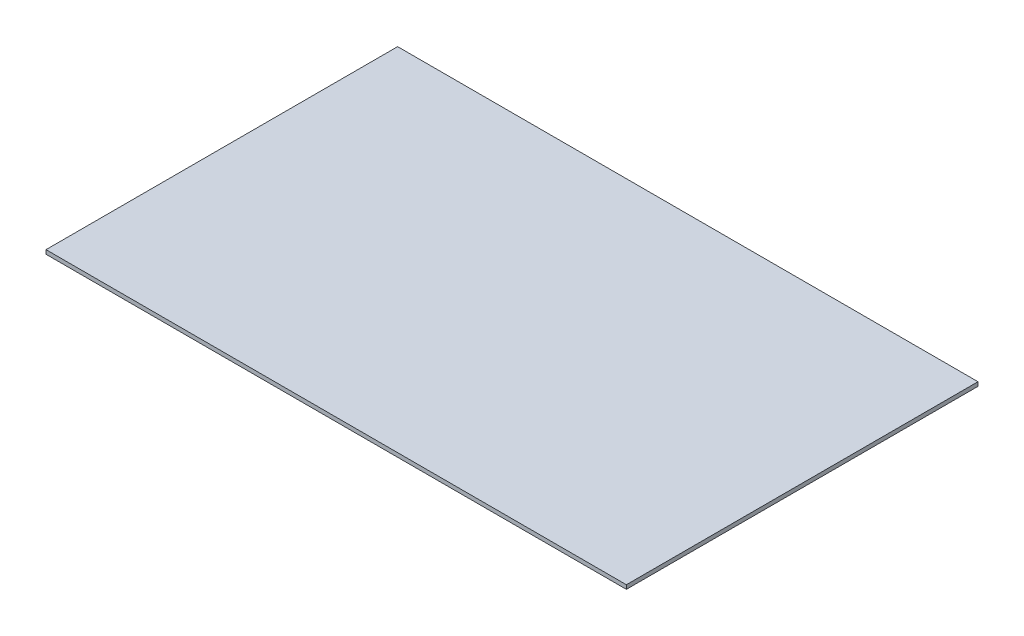
ISO-10303-21;
HEADER;
FILE_DESCRIPTION(('STEP AP214'),'2;1');
FILE_NAME('part.step','',(''),(''),'','','');
FILE_SCHEMA(('AUTOMOTIVE_DESIGN { 1 0 10303 214 1 1 1 1 }'));
ENDSEC;
DATA;
#1=APPLICATION_CONTEXT('core data for automotive mechanical design processes');
#2=APPLICATION_PROTOCOL_DEFINITION('international standard','automotive_design',2000,#1);
#3=PRODUCT_CONTEXT('',#1,'mechanical');
#4=PRODUCT('Part','Part','',(#3));
#5=PRODUCT_RELATED_PRODUCT_CATEGORY('part','',(#4));
#6=PRODUCT_DEFINITION_FORMATION('','',#4);
#7=PRODUCT_DEFINITION_CONTEXT('part definition',#1,'design');
#8=PRODUCT_DEFINITION('design','',#6,#7);
#9=PRODUCT_DEFINITION_SHAPE('','',#8);
#10=(LENGTH_UNIT() NAMED_UNIT(*) SI_UNIT(.MILLI.,.METRE.));
#11=(NAMED_UNIT(*) PLANE_ANGLE_UNIT() SI_UNIT($,.RADIAN.));
#12=(NAMED_UNIT(*) SI_UNIT($,.STERADIAN.) SOLID_ANGLE_UNIT());
#13=UNCERTAINTY_MEASURE_WITH_UNIT(LENGTH_MEASURE(1.E-05),#10,'distance_accuracy_value','');
#14=(GEOMETRIC_REPRESENTATION_CONTEXT(3) GLOBAL_UNCERTAINTY_ASSIGNED_CONTEXT((#13)) GLOBAL_UNIT_ASSIGNED_CONTEXT((#10,
#11,#12)) REPRESENTATION_CONTEXT('',''));
#15=CARTESIAN_POINT('',(0.,0.,0.));
#16=DIRECTION('',(0.,0.,1.));
#17=DIRECTION('',(1.,0.,0.));
#18=AXIS2_PLACEMENT_3D('',#15,#16,#17);
#19=CARTESIAN_POINT('',(0.,0.,277.48));
#20=DIRECTION('',(-1.,0.,0.));
#21=DIRECTION('',(0.,0.,1.));
#22=AXIS2_PLACEMENT_3D('',#19,#20,#21);
#23=PLANE('',#22);
#24=DIRECTION('',(0.,1.,0.));
#25=VECTOR('',#24,1.);
#26=CARTESIAN_POINT('',(0.,0.,0.));
#27=LINE('',#26,#25);
#28=CARTESIAN_POINT('',(0.,0.,0.));
#29=VERTEX_POINT('',#28);
#30=CARTESIAN_POINT('',(0.,3.175,0.));
#31=VERTEX_POINT('',#30);
#32=EDGE_CURVE('E116',#29,#31,#27,.T.);
#33=ORIENTED_EDGE('',*,*,#32,.F.);
#34=DIRECTION('',(0.,0.,-1.));
#35=VECTOR('',#34,1.);
#36=CARTESIAN_POINT('',(0.,0.,277.48));
#37=LINE('',#36,#35);
#38=CARTESIAN_POINT('',(0.,0.,277.48));
#39=VERTEX_POINT('',#38);
#40=EDGE_CURVE('E11',#39,#29,#37,.T.);
#41=ORIENTED_EDGE('',*,*,#40,.F.);
#42=DIRECTION('',(0.,1.,0.));
#43=VECTOR('',#42,1.);
#44=CARTESIAN_POINT('',(0.,0.,277.48));
#45=LINE('',#44,#43);
#46=CARTESIAN_POINT('',(0.,3.175,277.48));
#47=VERTEX_POINT('',#46);
#48=EDGE_CURVE('E108',#39,#47,#45,.T.);
#49=ORIENTED_EDGE('',*,*,#48,.T.);
#50=DIRECTION('',(0.,0.,-1.));
#51=VECTOR('',#50,1.);
#52=CARTESIAN_POINT('',(0.,3.175,277.48));
#53=LINE('',#52,#51);
#54=EDGE_CURVE('E48',#47,#31,#53,.T.);
#55=ORIENTED_EDGE('',*,*,#54,.T.);
#56=EDGE_LOOP('',(#33,#41,#49,#55));
#57=FACE_BOUND('',#56,.T.);
#58=ADVANCED_FACE('F45',(#57),#23,.T.);
#59=CARTESIAN_POINT('',(0.,0.,277.48));
#60=DIRECTION('',(0.,1.,0.));
#61=DIRECTION('',(0.,0.,1.));
#62=AXIS2_PLACEMENT_3D('',#59,#60,#61);
#63=PLANE('',#62);
#64=DIRECTION('',(1.,0.,0.));
#65=VECTOR('',#64,1.);
#66=CARTESIAN_POINT('',(0.,0.,0.));
#67=LINE('',#66,#65);
#68=CARTESIAN_POINT('',(458.,0.,0.));
#69=VERTEX_POINT('',#68);
#70=EDGE_CURVE('E111',#29,#69,#67,.T.);
#71=ORIENTED_EDGE('',*,*,#70,.T.);
#72=DIRECTION('',(0.,0.,-1.));
#73=VECTOR('',#72,1.);
#74=CARTESIAN_POINT('',(458.,0.,277.48));
#75=LINE('',#74,#73);
#76=CARTESIAN_POINT('',(458.,0.,277.48));
#77=VERTEX_POINT('',#76);
#78=EDGE_CURVE('E55',#77,#69,#75,.T.);
#79=ORIENTED_EDGE('',*,*,#78,.F.);
#80=DIRECTION('',(1.,0.,0.));
#81=VECTOR('',#80,1.);
#82=CARTESIAN_POINT('',(0.,0.,277.48));
#83=LINE('',#82,#81);
#84=EDGE_CURVE('E103',#39,#77,#83,.T.);
#85=ORIENTED_EDGE('',*,*,#84,.F.);
#86=ORIENTED_EDGE('',*,*,#40,.T.);
#87=EDGE_LOOP('',(#71,#79,#85,#86));
#88=FACE_BOUND('',#87,.T.);
#89=ADVANCED_FACE('F131',(#88),#63,.F.);
#90=CARTESIAN_POINT('',(458.,3.175,277.48));
#91=DIRECTION('',(1.,0.,0.));
#92=DIRECTION('',(0.,0.,-1.));
#93=AXIS2_PLACEMENT_3D('',#90,#91,#92);
#94=PLANE('',#93);
#95=DIRECTION('',(0.,-1.,0.));
#96=VECTOR('',#95,1.);
#97=CARTESIAN_POINT('',(458.,3.175,0.));
#98=LINE('',#97,#96);
#99=CARTESIAN_POINT('',(458.,3.175,0.));
#100=VERTEX_POINT('',#99);
#101=EDGE_CURVE('E96',#100,#69,#98,.T.);
#102=ORIENTED_EDGE('',*,*,#101,.F.);
#103=DIRECTION('',(0.,0.,-1.));
#104=VECTOR('',#103,1.);
#105=CARTESIAN_POINT('',(458.,3.175,277.48));
#106=LINE('',#105,#104);
#107=CARTESIAN_POINT('',(458.,3.175,277.48));
#108=VERTEX_POINT('',#107);
#109=EDGE_CURVE('E91',#108,#100,#106,.T.);
#110=ORIENTED_EDGE('',*,*,#109,.F.);
#111=DIRECTION('',(0.,-1.,0.));
#112=VECTOR('',#111,1.);
#113=CARTESIAN_POINT('',(458.,3.175,277.48));
#114=LINE('',#113,#112);
#115=EDGE_CURVE('E94',#108,#77,#114,.T.);
#116=ORIENTED_EDGE('',*,*,#115,.T.);
#117=ORIENTED_EDGE('',*,*,#78,.T.);
#118=EDGE_LOOP('',(#102,#110,#116,#117));
#119=FACE_BOUND('',#118,.T.);
#120=ADVANCED_FACE('F93',(#119),#94,.T.);
#121=CARTESIAN_POINT('',(0.,3.175,277.48));
#122=DIRECTION('',(0.,1.,0.));
#123=DIRECTION('',(0.,0.,1.));
#124=AXIS2_PLACEMENT_3D('',#121,#122,#123);
#125=PLANE('',#124);
#126=DIRECTION('',(1.,0.,0.));
#127=VECTOR('',#126,1.);
#128=CARTESIAN_POINT('',(0.,3.175,0.));
#129=LINE('',#128,#127);
#130=EDGE_CURVE('E120',#31,#100,#129,.T.);
#131=ORIENTED_EDGE('',*,*,#130,.F.);
#132=ORIENTED_EDGE('',*,*,#54,.F.);
#133=DIRECTION('',(1.,0.,0.));
#134=VECTOR('',#133,1.);
#135=CARTESIAN_POINT('',(0.,3.175,277.48));
#136=LINE('',#135,#134);
#137=EDGE_CURVE('E102',#47,#108,#136,.T.);
#138=ORIENTED_EDGE('',*,*,#137,.T.);
#139=ORIENTED_EDGE('',*,*,#109,.T.);
#140=EDGE_LOOP('',(#131,#132,#138,#139));
#141=FACE_BOUND('',#140,.T.);
#142=ADVANCED_FACE('F106',(#141),#125,.T.);
#143=CARTESIAN_POINT('',(0.,0.,277.48));
#144=DIRECTION('',(0.,0.,-1.));
#145=DIRECTION('',(-1.,0.,0.));
#146=AXIS2_PLACEMENT_3D('',#143,#144,#145);
#147=PLANE('',#146);
#148=ORIENTED_EDGE('',*,*,#48,.F.);
#149=ORIENTED_EDGE('',*,*,#84,.T.);
#150=ORIENTED_EDGE('',*,*,#115,.F.);
#151=ORIENTED_EDGE('',*,*,#137,.F.);
#152=EDGE_LOOP('',(#148,#149,#150,#151));
#153=FACE_BOUND('',#152,.T.);
#154=ADVANCED_FACE('F101',(#153),#147,.F.);
#155=CARTESIAN_POINT('',(0.,0.,0.));
#156=DIRECTION('',(0.,0.,-1.));
#157=DIRECTION('',(-1.,0.,0.));
#158=AXIS2_PLACEMENT_3D('',#155,#156,#157);
#159=PLANE('',#158);
#160=ORIENTED_EDGE('',*,*,#32,.T.);
#161=ORIENTED_EDGE('',*,*,#130,.T.);
#162=ORIENTED_EDGE('',*,*,#101,.T.);
#163=ORIENTED_EDGE('',*,*,#70,.F.);
#164=EDGE_LOOP('',(#160,#161,#162,#163));
#165=FACE_BOUND('',#164,.T.);
#166=ADVANCED_FACE('F130',(#165),#159,.T.);
#167=CLOSED_SHELL('',(#58,#89,#120,#142,#154,#166));
#168=MANIFOLD_SOLID_BREP('B2',#167);
#169=ADVANCED_BREP_SHAPE_REPRESENTATION('',(#18,#168),#14);
#170=SHAPE_DEFINITION_REPRESENTATION(#9,#169);
ENDSEC;
END-ISO-10303-21;
